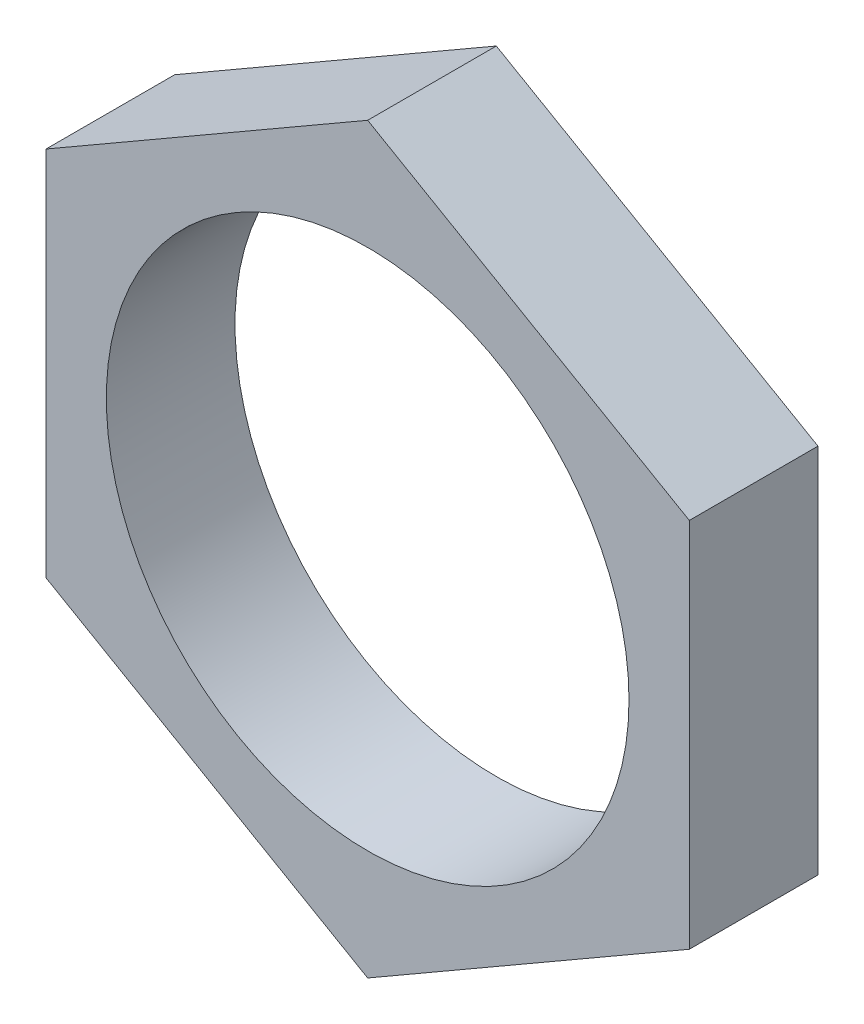
ISO-10303-21;
HEADER;
FILE_DESCRIPTION(('STEP AP214'),'2;1');
FILE_NAME('part.step','',(''),(''),'','','');
FILE_SCHEMA(('AUTOMOTIVE_DESIGN { 1 0 10303 214 1 1 1 1 }'));
ENDSEC;
DATA;
#1=APPLICATION_CONTEXT('core data for automotive mechanical design processes');
#2=APPLICATION_PROTOCOL_DEFINITION('international standard','automotive_design',2000,#1);
#3=PRODUCT_CONTEXT('',#1,'mechanical');
#4=PRODUCT('Part','Part','',(#3));
#5=PRODUCT_RELATED_PRODUCT_CATEGORY('part','',(#4));
#6=PRODUCT_DEFINITION_FORMATION('','',#4);
#7=PRODUCT_DEFINITION_CONTEXT('part definition',#1,'design');
#8=PRODUCT_DEFINITION('design','',#6,#7);
#9=PRODUCT_DEFINITION_SHAPE('','',#8);
#10=(LENGTH_UNIT() NAMED_UNIT(*) SI_UNIT(.MILLI.,.METRE.));
#11=(NAMED_UNIT(*) PLANE_ANGLE_UNIT() SI_UNIT($,.RADIAN.));
#12=(NAMED_UNIT(*) SI_UNIT($,.STERADIAN.) SOLID_ANGLE_UNIT());
#13=UNCERTAINTY_MEASURE_WITH_UNIT(LENGTH_MEASURE(1.E-05),#10,'distance_accuracy_value','');
#14=(GEOMETRIC_REPRESENTATION_CONTEXT(3) GLOBAL_UNCERTAINTY_ASSIGNED_CONTEXT((#13)) GLOBAL_UNIT_ASSIGNED_CONTEXT((#10,
#11,#12)) REPRESENTATION_CONTEXT('',''));
#15=CARTESIAN_POINT('',(0.,0.,0.));
#16=DIRECTION('',(0.,0.,1.));
#17=DIRECTION('',(1.,0.,0.));
#18=AXIS2_PLACEMENT_3D('',#15,#16,#17);
#19=CARTESIAN_POINT('',(-8.,0.,1.6));
#20=DIRECTION('',(0.,0.,1.));
#21=DIRECTION('',(1.,0.,0.));
#22=AXIS2_PLACEMENT_3D('',#19,#20,#21);
#23=PLANE('',#22);
#24=DIRECTION('',(-0.866025403784439,-0.5,0.));
#25=VECTOR('',#24,1.);
#26=CARTESIAN_POINT('',(0.,4.61880215351701,1.6));
#27=LINE('',#26,#25);
#28=CARTESIAN_POINT('',(0.,4.61880215351701,1.6));
#29=VERTEX_POINT('',#28);
#30=CARTESIAN_POINT('',(-4.,2.3094010767585,1.6));
#31=VERTEX_POINT('',#30);
#32=EDGE_CURVE('E128',#29,#31,#27,.T.);
#33=ORIENTED_EDGE('',*,*,#32,.T.);
#34=DIRECTION('',(0.,-1.,0.));
#35=VECTOR('',#34,1.);
#36=CARTESIAN_POINT('',(-4.,2.3094010767585,1.6));
#37=LINE('',#36,#35);
#38=CARTESIAN_POINT('',(-4.,-2.3094010767585,1.6));
#39=VERTEX_POINT('',#38);
#40=EDGE_CURVE('E86',#31,#39,#37,.T.);
#41=ORIENTED_EDGE('',*,*,#40,.T.);
#42=DIRECTION('',(0.866025403784439,-0.5,0.));
#43=VECTOR('',#42,1.);
#44=CARTESIAN_POINT('',(-4.,-2.3094010767585,1.6));
#45=LINE('',#44,#43);
#46=CARTESIAN_POINT('',(0.,-4.61880215351701,1.6));
#47=VERTEX_POINT('',#46);
#48=EDGE_CURVE('E99',#39,#47,#45,.T.);
#49=ORIENTED_EDGE('',*,*,#48,.T.);
#50=DIRECTION('',(0.866025403784438,0.5,0.));
#51=VECTOR('',#50,1.);
#52=CARTESIAN_POINT('',(0.,-4.61880215351701,1.6));
#53=LINE('',#52,#51);
#54=CARTESIAN_POINT('',(4.,-2.3094010767585,1.6));
#55=VERTEX_POINT('',#54);
#56=EDGE_CURVE('E93',#47,#55,#53,.T.);
#57=ORIENTED_EDGE('',*,*,#56,.T.);
#58=DIRECTION('',(0.,1.,0.));
#59=VECTOR('',#58,1.);
#60=CARTESIAN_POINT('',(4.,-2.3094010767585,1.6));
#61=LINE('',#60,#59);
#62=CARTESIAN_POINT('',(4.,2.3094010767585,1.6));
#63=VERTEX_POINT('',#62);
#64=EDGE_CURVE('E97',#55,#63,#61,.T.);
#65=ORIENTED_EDGE('',*,*,#64,.T.);
#66=DIRECTION('',(-0.866025403784439,0.5,0.));
#67=VECTOR('',#66,1.);
#68=CARTESIAN_POINT('',(4.,2.3094010767585,1.6));
#69=LINE('',#68,#67);
#70=EDGE_CURVE('E49',#63,#29,#69,.T.);
#71=ORIENTED_EDGE('',*,*,#70,.T.);
#72=EDGE_LOOP('',(#33,#41,#49,#57,#65,#71));
#73=FACE_BOUND('',#72,.T.);
#74=CARTESIAN_POINT('',(0.,0.,1.6));
#75=DIRECTION('',(0.,0.,1.));
#76=DIRECTION('',(1.,0.,0.));
#77=AXIS2_PLACEMENT_3D('',#74,#75,#76);
#78=CIRCLE('',#77,3.25);
#79=CARTESIAN_POINT('',(3.25,0.,1.6));
#80=VERTEX_POINT('',#79);
#81=EDGE_CURVE('E121',#80,#80,#78,.T.);
#82=ORIENTED_EDGE('',*,*,#81,.F.);
#83=EDGE_LOOP('',(#82));
#84=FACE_BOUND('',#83,.T.);
#85=ADVANCED_FACE('F32',(#73,#84),#23,.T.);
#86=CARTESIAN_POINT('',(-8.,0.,0.));
#87=DIRECTION('',(0.,0.,1.));
#88=DIRECTION('',(1.,0.,0.));
#89=AXIS2_PLACEMENT_3D('',#86,#87,#88);
#90=PLANE('',#89);
#91=DIRECTION('',(-0.866025403784439,-0.5,0.));
#92=VECTOR('',#91,1.);
#93=CARTESIAN_POINT('',(0.,4.61880215351701,0.));
#94=LINE('',#93,#92);
#95=CARTESIAN_POINT('',(0.,4.61880215351701,0.));
#96=VERTEX_POINT('',#95);
#97=CARTESIAN_POINT('',(-4.,2.3094010767585,0.));
#98=VERTEX_POINT('',#97);
#99=EDGE_CURVE('E117',#96,#98,#94,.T.);
#100=ORIENTED_EDGE('',*,*,#99,.F.);
#101=DIRECTION('',(-0.866025403784439,0.5,0.));
#102=VECTOR('',#101,1.);
#103=CARTESIAN_POINT('',(4.,2.3094010767585,0.));
#104=LINE('',#103,#102);
#105=CARTESIAN_POINT('',(4.,2.3094010767585,0.));
#106=VERTEX_POINT('',#105);
#107=EDGE_CURVE('E78',#106,#96,#104,.T.);
#108=ORIENTED_EDGE('',*,*,#107,.F.);
#109=DIRECTION('',(0.,1.,0.));
#110=VECTOR('',#109,1.);
#111=CARTESIAN_POINT('',(4.,-2.3094010767585,0.));
#112=LINE('',#111,#110);
#113=CARTESIAN_POINT('',(4.,-2.3094010767585,0.));
#114=VERTEX_POINT('',#113);
#115=EDGE_CURVE('E72',#114,#106,#112,.T.);
#116=ORIENTED_EDGE('',*,*,#115,.F.);
#117=DIRECTION('',(0.866025403784438,0.5,0.));
#118=VECTOR('',#117,1.);
#119=CARTESIAN_POINT('',(0.,-4.61880215351701,0.));
#120=LINE('',#119,#118);
#121=CARTESIAN_POINT('',(0.,-4.61880215351701,0.));
#122=VERTEX_POINT('',#121);
#123=EDGE_CURVE('E107',#122,#114,#120,.T.);
#124=ORIENTED_EDGE('',*,*,#123,.F.);
#125=DIRECTION('',(0.866025403784439,-0.5,0.));
#126=VECTOR('',#125,1.);
#127=CARTESIAN_POINT('',(-4.,-2.3094010767585,0.));
#128=LINE('',#127,#126);
#129=CARTESIAN_POINT('',(-4.,-2.3094010767585,0.));
#130=VERTEX_POINT('',#129);
#131=EDGE_CURVE('E123',#130,#122,#128,.T.);
#132=ORIENTED_EDGE('',*,*,#131,.F.);
#133=DIRECTION('',(0.,-1.,0.));
#134=VECTOR('',#133,1.);
#135=CARTESIAN_POINT('',(-4.,2.3094010767585,0.));
#136=LINE('',#135,#134);
#137=EDGE_CURVE('E120',#98,#130,#136,.T.);
#138=ORIENTED_EDGE('',*,*,#137,.F.);
#139=EDGE_LOOP('',(#100,#108,#116,#124,#132,#138));
#140=FACE_BOUND('',#139,.T.);
#141=CARTESIAN_POINT('',(0.,0.,0.));
#142=DIRECTION('',(0.,0.,1.));
#143=DIRECTION('',(1.,0.,0.));
#144=AXIS2_PLACEMENT_3D('',#141,#142,#143);
#145=CIRCLE('',#144,3.25);
#146=CARTESIAN_POINT('',(3.25,0.,0.));
#147=VERTEX_POINT('',#146);
#148=EDGE_CURVE('E221',#147,#147,#145,.T.);
#149=ORIENTED_EDGE('',*,*,#148,.T.);
#150=EDGE_LOOP('',(#149));
#151=FACE_BOUND('',#150,.T.);
#152=ADVANCED_FACE('F137',(#140,#151),#90,.F.);
#153=CARTESIAN_POINT('',(0.,4.61880215351701,1.6));
#154=DIRECTION('',(0.5,-0.866025403784439,0.));
#155=DIRECTION('',(0.866025403784439,0.5,0.));
#156=AXIS2_PLACEMENT_3D('',#153,#154,#155);
#157=PLANE('',#156);
#158=ORIENTED_EDGE('',*,*,#99,.T.);
#159=DIRECTION('',(0.,0.,-1.));
#160=VECTOR('',#159,1.);
#161=CARTESIAN_POINT('',(-4.,2.3094010767585,1.6));
#162=LINE('',#161,#160);
#163=EDGE_CURVE('E11',#31,#98,#162,.T.);
#164=ORIENTED_EDGE('',*,*,#163,.F.);
#165=ORIENTED_EDGE('',*,*,#32,.F.);
#166=DIRECTION('',(0.,0.,-1.));
#167=VECTOR('',#166,1.);
#168=CARTESIAN_POINT('',(0.,4.61880215351701,1.6));
#169=LINE('',#168,#167);
#170=EDGE_CURVE('E113',#29,#96,#169,.T.);
#171=ORIENTED_EDGE('',*,*,#170,.T.);
#172=EDGE_LOOP('',(#158,#164,#165,#171));
#173=FACE_BOUND('',#172,.T.);
#174=ADVANCED_FACE('F34',(#173),#157,.F.);
#175=CARTESIAN_POINT('',(-4.,2.3094010767585,1.6));
#176=DIRECTION('',(1.,0.,0.));
#177=DIRECTION('',(0.,1.,0.));
#178=AXIS2_PLACEMENT_3D('',#175,#176,#177);
#179=PLANE('',#178);
#180=ORIENTED_EDGE('',*,*,#137,.T.);
#181=DIRECTION('',(0.,0.,-1.));
#182=VECTOR('',#181,1.);
#183=CARTESIAN_POINT('',(-4.,-2.3094010767585,1.6));
#184=LINE('',#183,#182);
#185=EDGE_CURVE('E41',#39,#130,#184,.T.);
#186=ORIENTED_EDGE('',*,*,#185,.F.);
#187=ORIENTED_EDGE('',*,*,#40,.F.);
#188=ORIENTED_EDGE('',*,*,#163,.T.);
#189=EDGE_LOOP('',(#180,#186,#187,#188));
#190=FACE_BOUND('',#189,.T.);
#191=ADVANCED_FACE('F162',(#190),#179,.F.);
#192=CARTESIAN_POINT('',(-4.,-2.3094010767585,1.6));
#193=DIRECTION('',(0.5,0.866025403784439,0.));
#194=DIRECTION('',(-0.866025403784439,0.5,0.));
#195=AXIS2_PLACEMENT_3D('',#192,#193,#194);
#196=PLANE('',#195);
#197=ORIENTED_EDGE('',*,*,#131,.T.);
#198=DIRECTION('',(0.,0.,-1.));
#199=VECTOR('',#198,1.);
#200=CARTESIAN_POINT('',(0.,-4.61880215351701,1.6));
#201=LINE('',#200,#199);
#202=EDGE_CURVE('E108',#47,#122,#201,.T.);
#203=ORIENTED_EDGE('',*,*,#202,.F.);
#204=ORIENTED_EDGE('',*,*,#48,.F.);
#205=ORIENTED_EDGE('',*,*,#185,.T.);
#206=EDGE_LOOP('',(#197,#203,#204,#205));
#207=FACE_BOUND('',#206,.T.);
#208=ADVANCED_FACE('F134',(#207),#196,.F.);
#209=CARTESIAN_POINT('',(0.,-4.61880215351701,1.6));
#210=DIRECTION('',(-0.5,0.866025403784438,0.));
#211=DIRECTION('',(-0.866025403784438,-0.5,0.));
#212=AXIS2_PLACEMENT_3D('',#209,#210,#211);
#213=PLANE('',#212);
#214=ORIENTED_EDGE('',*,*,#123,.T.);
#215=DIRECTION('',(0.,0.,-1.));
#216=VECTOR('',#215,1.);
#217=CARTESIAN_POINT('',(4.,-2.3094010767585,1.6));
#218=LINE('',#217,#216);
#219=EDGE_CURVE('E104',#55,#114,#218,.T.);
#220=ORIENTED_EDGE('',*,*,#219,.F.);
#221=ORIENTED_EDGE('',*,*,#56,.F.);
#222=ORIENTED_EDGE('',*,*,#202,.T.);
#223=EDGE_LOOP('',(#214,#220,#221,#222));
#224=FACE_BOUND('',#223,.T.);
#225=ADVANCED_FACE('F105',(#224),#213,.F.);
#226=CARTESIAN_POINT('',(4.,-2.3094010767585,1.6));
#227=DIRECTION('',(-1.,0.,0.));
#228=DIRECTION('',(0.,0.,1.));
#229=AXIS2_PLACEMENT_3D('',#226,#227,#228);
#230=PLANE('',#229);
#231=ORIENTED_EDGE('',*,*,#115,.T.);
#232=DIRECTION('',(0.,0.,-1.));
#233=VECTOR('',#232,1.);
#234=CARTESIAN_POINT('',(4.,2.3094010767585,1.6));
#235=LINE('',#234,#233);
#236=EDGE_CURVE('E109',#63,#106,#235,.T.);
#237=ORIENTED_EDGE('',*,*,#236,.F.);
#238=ORIENTED_EDGE('',*,*,#64,.F.);
#239=ORIENTED_EDGE('',*,*,#219,.T.);
#240=EDGE_LOOP('',(#231,#237,#238,#239));
#241=FACE_BOUND('',#240,.T.);
#242=ADVANCED_FACE('F111',(#241),#230,.F.);
#243=CARTESIAN_POINT('',(4.,2.3094010767585,1.6));
#244=DIRECTION('',(-0.5,-0.866025403784439,0.));
#245=DIRECTION('',(0.866025403784439,-0.5,0.));
#246=AXIS2_PLACEMENT_3D('',#243,#244,#245);
#247=PLANE('',#246);
#248=ORIENTED_EDGE('',*,*,#107,.T.);
#249=ORIENTED_EDGE('',*,*,#170,.F.);
#250=ORIENTED_EDGE('',*,*,#70,.F.);
#251=ORIENTED_EDGE('',*,*,#236,.T.);
#252=EDGE_LOOP('',(#248,#249,#250,#251));
#253=FACE_BOUND('',#252,.T.);
#254=ADVANCED_FACE('F142',(#253),#247,.F.);
#255=CARTESIAN_POINT('',(0.,0.,1.6));
#256=DIRECTION('',(0.,0.,-1.));
#257=DIRECTION('',(-1.,0.,0.));
#258=AXIS2_PLACEMENT_3D('',#255,#256,#257);
#259=CYLINDRICAL_SURFACE('',#258,3.25);
#260=ORIENTED_EDGE('',*,*,#81,.T.);
#261=EDGE_LOOP('',(#260));
#262=FACE_BOUND('',#261,.T.);
#263=ORIENTED_EDGE('',*,*,#148,.F.);
#264=EDGE_LOOP('',(#263));
#265=FACE_BOUND('',#264,.T.);
#266=ADVANCED_FACE('F144',(#262,#265),#259,.F.);
#267=CLOSED_SHELL('',(#85,#152,#174,#191,#208,#225,#242,#254,#266));
#268=MANIFOLD_SOLID_BREP('B2',#267);
#269=ADVANCED_BREP_SHAPE_REPRESENTATION('',(#18,#268),#14);
#270=SHAPE_DEFINITION_REPRESENTATION(#9,#269);
ENDSEC;
END-ISO-10303-21;
